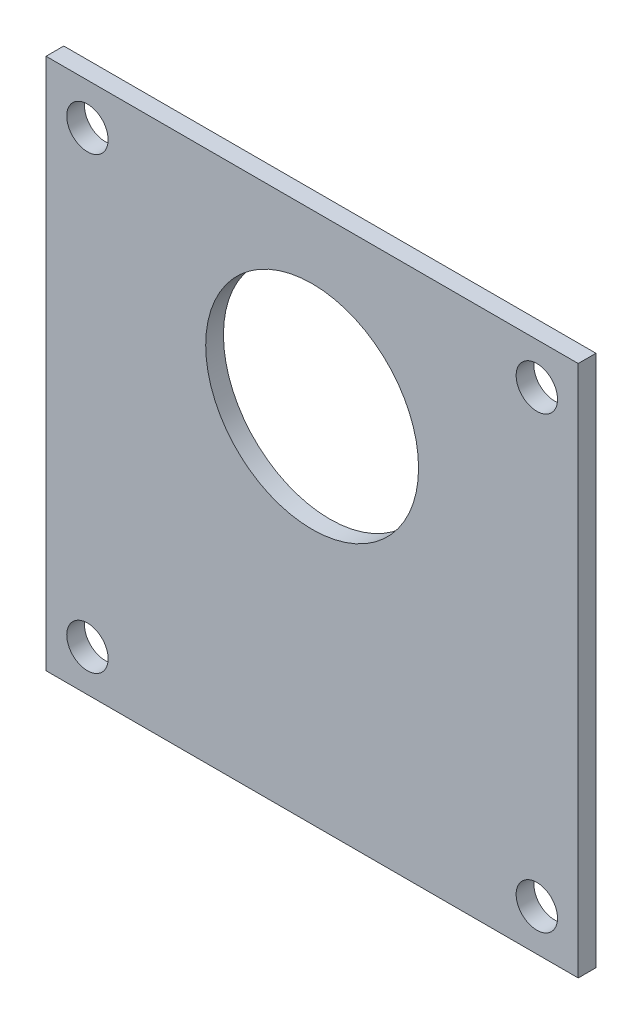
ISO-10303-21;
HEADER;
FILE_DESCRIPTION(('STEP AP214'),'2;1');
FILE_NAME('part.step','',(''),(''),'','','');
FILE_SCHEMA(('AUTOMOTIVE_DESIGN { 1 0 10303 214 1 1 1 1 }'));
ENDSEC;
DATA;
#1=APPLICATION_CONTEXT('core data for automotive mechanical design processes');
#2=APPLICATION_PROTOCOL_DEFINITION('international standard','automotive_design',2000,#1);
#3=PRODUCT_CONTEXT('',#1,'mechanical');
#4=PRODUCT('Part','Part','',(#3));
#5=PRODUCT_RELATED_PRODUCT_CATEGORY('part','',(#4));
#6=PRODUCT_DEFINITION_FORMATION('','',#4);
#7=PRODUCT_DEFINITION_CONTEXT('part definition',#1,'design');
#8=PRODUCT_DEFINITION('design','',#6,#7);
#9=PRODUCT_DEFINITION_SHAPE('','',#8);
#10=(LENGTH_UNIT() NAMED_UNIT(*) SI_UNIT(.MILLI.,.METRE.));
#11=(NAMED_UNIT(*) PLANE_ANGLE_UNIT() SI_UNIT($,.RADIAN.));
#12=(NAMED_UNIT(*) SI_UNIT($,.STERADIAN.) SOLID_ANGLE_UNIT());
#13=UNCERTAINTY_MEASURE_WITH_UNIT(LENGTH_MEASURE(1.E-05),#10,'distance_accuracy_value','');
#14=(GEOMETRIC_REPRESENTATION_CONTEXT(3) GLOBAL_UNCERTAINTY_ASSIGNED_CONTEXT((#13)) GLOBAL_UNIT_ASSIGNED_CONTEXT((#10,
#11,#12)) REPRESENTATION_CONTEXT('',''));
#15=CARTESIAN_POINT('',(0.,0.,0.));
#16=DIRECTION('',(0.,0.,1.));
#17=DIRECTION('',(1.,0.,0.));
#18=AXIS2_PLACEMENT_3D('',#15,#16,#17);
#19=CARTESIAN_POINT('',(22.5,22.5,1.5));
#20=DIRECTION('',(-1.,0.,0.));
#21=DIRECTION('',(0.,-1.,0.));
#22=AXIS2_PLACEMENT_3D('',#19,#20,#21);
#23=PLANE('',#22);
#24=DIRECTION('',(0.,1.,0.));
#25=VECTOR('',#24,1.);
#26=CARTESIAN_POINT('',(22.5,22.5,0.));
#27=LINE('',#26,#25);
#28=CARTESIAN_POINT('',(22.5,-22.5,0.));
#29=VERTEX_POINT('',#28);
#30=CARTESIAN_POINT('',(22.5,22.5,0.));
#31=VERTEX_POINT('',#30);
#32=EDGE_CURVE('E96',#29,#31,#27,.T.);
#33=ORIENTED_EDGE('',*,*,#32,.T.);
#34=DIRECTION('',(0.,0.,-1.));
#35=VECTOR('',#34,1.);
#36=CARTESIAN_POINT('',(22.5,22.5,1.5));
#37=LINE('',#36,#35);
#38=CARTESIAN_POINT('',(22.5,22.5,1.5));
#39=VERTEX_POINT('',#38);
#40=EDGE_CURVE('E11',#39,#31,#37,.T.);
#41=ORIENTED_EDGE('',*,*,#40,.F.);
#42=DIRECTION('',(0.,1.,0.));
#43=VECTOR('',#42,1.);
#44=CARTESIAN_POINT('',(22.5,22.5,1.5));
#45=LINE('',#44,#43);
#46=CARTESIAN_POINT('',(22.5,-22.5,1.5));
#47=VERTEX_POINT('',#46);
#48=EDGE_CURVE('E84',#47,#39,#45,.T.);
#49=ORIENTED_EDGE('',*,*,#48,.F.);
#50=DIRECTION('',(0.,0.,-1.));
#51=VECTOR('',#50,1.);
#52=CARTESIAN_POINT('',(22.5,-22.5,1.5));
#53=LINE('',#52,#51);
#54=EDGE_CURVE('E92',#47,#29,#53,.T.);
#55=ORIENTED_EDGE('',*,*,#54,.T.);
#56=EDGE_LOOP('',(#33,#41,#49,#55));
#57=FACE_BOUND('',#56,.T.);
#58=ADVANCED_FACE('F33',(#57),#23,.F.);
#59=CARTESIAN_POINT('',(-22.5,22.5,1.5));
#60=DIRECTION('',(0.,-1.,0.));
#61=DIRECTION('',(0.,0.,-1.));
#62=AXIS2_PLACEMENT_3D('',#59,#60,#61);
#63=PLANE('',#62);
#64=DIRECTION('',(-1.,0.,0.));
#65=VECTOR('',#64,1.);
#66=CARTESIAN_POINT('',(-22.5,22.5,0.));
#67=LINE('',#66,#65);
#68=CARTESIAN_POINT('',(-22.5,22.5,0.));
#69=VERTEX_POINT('',#68);
#70=EDGE_CURVE('E88',#31,#69,#67,.T.);
#71=ORIENTED_EDGE('',*,*,#70,.T.);
#72=DIRECTION('',(0.,0.,-1.));
#73=VECTOR('',#72,1.);
#74=CARTESIAN_POINT('',(-22.5,22.5,1.5));
#75=LINE('',#74,#73);
#76=CARTESIAN_POINT('',(-22.5,22.5,1.5));
#77=VERTEX_POINT('',#76);
#78=EDGE_CURVE('E41',#77,#69,#75,.T.);
#79=ORIENTED_EDGE('',*,*,#78,.F.);
#80=DIRECTION('',(-1.,0.,0.));
#81=VECTOR('',#80,1.);
#82=CARTESIAN_POINT('',(-22.5,22.5,1.5));
#83=LINE('',#82,#81);
#84=EDGE_CURVE('E79',#39,#77,#83,.T.);
#85=ORIENTED_EDGE('',*,*,#84,.F.);
#86=ORIENTED_EDGE('',*,*,#40,.T.);
#87=EDGE_LOOP('',(#71,#79,#85,#86));
#88=FACE_BOUND('',#87,.T.);
#89=ADVANCED_FACE('F87',(#88),#63,.F.);
#90=CARTESIAN_POINT('',(-22.5,22.5,1.5));
#91=DIRECTION('',(1.,0.,0.));
#92=DIRECTION('',(0.,1.,0.));
#93=AXIS2_PLACEMENT_3D('',#90,#91,#92);
#94=PLANE('',#93);
#95=DIRECTION('',(0.,-1.,0.));
#96=VECTOR('',#95,1.);
#97=CARTESIAN_POINT('',(-22.5,22.5,0.));
#98=LINE('',#97,#96);
#99=CARTESIAN_POINT('',(-22.5,-22.5,0.));
#100=VERTEX_POINT('',#99);
#101=EDGE_CURVE('E66',#69,#100,#98,.T.);
#102=ORIENTED_EDGE('',*,*,#101,.T.);
#103=DIRECTION('',(0.,0.,-1.));
#104=VECTOR('',#103,1.);
#105=CARTESIAN_POINT('',(-22.5,-22.5,1.5));
#106=LINE('',#105,#104);
#107=CARTESIAN_POINT('',(-22.5,-22.5,1.5));
#108=VERTEX_POINT('',#107);
#109=EDGE_CURVE('E89',#108,#100,#106,.T.);
#110=ORIENTED_EDGE('',*,*,#109,.F.);
#111=DIRECTION('',(0.,-1.,0.));
#112=VECTOR('',#111,1.);
#113=CARTESIAN_POINT('',(-22.5,22.5,1.5));
#114=LINE('',#113,#112);
#115=EDGE_CURVE('E82',#77,#108,#114,.T.);
#116=ORIENTED_EDGE('',*,*,#115,.F.);
#117=ORIENTED_EDGE('',*,*,#78,.T.);
#118=EDGE_LOOP('',(#102,#110,#116,#117));
#119=FACE_BOUND('',#118,.T.);
#120=ADVANCED_FACE('F90',(#119),#94,.F.);
#121=CARTESIAN_POINT('',(-22.5,-22.5,1.5));
#122=DIRECTION('',(0.,1.,0.));
#123=DIRECTION('',(0.,0.,1.));
#124=AXIS2_PLACEMENT_3D('',#121,#122,#123);
#125=PLANE('',#124);
#126=DIRECTION('',(1.,0.,0.));
#127=VECTOR('',#126,1.);
#128=CARTESIAN_POINT('',(-22.5,-22.5,0.));
#129=LINE('',#128,#127);
#130=EDGE_CURVE('E72',#100,#29,#129,.T.);
#131=ORIENTED_EDGE('',*,*,#130,.T.);
#132=ORIENTED_EDGE('',*,*,#54,.F.);
#133=DIRECTION('',(1.,0.,0.));
#134=VECTOR('',#133,1.);
#135=CARTESIAN_POINT('',(-22.5,-22.5,1.5));
#136=LINE('',#135,#134);
#137=EDGE_CURVE('E49',#108,#47,#136,.T.);
#138=ORIENTED_EDGE('',*,*,#137,.F.);
#139=ORIENTED_EDGE('',*,*,#109,.T.);
#140=EDGE_LOOP('',(#131,#132,#138,#139));
#141=FACE_BOUND('',#140,.T.);
#142=ADVANCED_FACE('F104',(#141),#125,.F.);
#143=CARTESIAN_POINT('',(0.,0.,1.5));
#144=DIRECTION('',(0.,0.,1.));
#145=DIRECTION('',(1.,0.,0.));
#146=AXIS2_PLACEMENT_3D('',#143,#144,#145);
#147=PLANE('',#146);
#148=CARTESIAN_POINT('',(0.,8.1,1.5));
#149=DIRECTION('',(0.,0.,1.));
#150=DIRECTION('',(1.,0.,0.));
#151=AXIS2_PLACEMENT_3D('',#148,#149,#150);
#152=CIRCLE('',#151,9.);
#153=CARTESIAN_POINT('',(9.,8.1,1.5));
#154=VERTEX_POINT('',#153);
#155=EDGE_CURVE('E134',#154,#154,#152,.T.);
#156=ORIENTED_EDGE('',*,*,#155,.F.);
#157=EDGE_LOOP('',(#156));
#158=FACE_BOUND('',#157,.T.);
#159=CARTESIAN_POINT('',(-19.,-19.,1.5));
#160=DIRECTION('',(0.,0.,1.));
#161=DIRECTION('',(-1.,0.,0.));
#162=AXIS2_PLACEMENT_3D('',#159,#160,#161);
#163=CIRCLE('',#162,1.75);
#164=CARTESIAN_POINT('',(-20.75,-19.,1.5));
#165=VERTEX_POINT('',#164);
#166=EDGE_CURVE('E128',#165,#165,#163,.T.);
#167=ORIENTED_EDGE('',*,*,#166,.F.);
#168=EDGE_LOOP('',(#167));
#169=FACE_BOUND('',#168,.T.);
#170=CARTESIAN_POINT('',(19.,19.,1.5));
#171=DIRECTION('',(0.,0.,1.));
#172=DIRECTION('',(1.,0.,0.));
#173=AXIS2_PLACEMENT_3D('',#170,#171,#172);
#174=CIRCLE('',#173,1.75000000000004);
#175=CARTESIAN_POINT('',(20.75,19.,1.5));
#176=VERTEX_POINT('',#175);
#177=EDGE_CURVE('E122',#176,#176,#174,.T.);
#178=ORIENTED_EDGE('',*,*,#177,.F.);
#179=EDGE_LOOP('',(#178));
#180=FACE_BOUND('',#179,.T.);
#181=CARTESIAN_POINT('',(19.,-19.,1.5));
#182=DIRECTION('',(0.,0.,1.));
#183=DIRECTION('',(-1.,0.,0.));
#184=AXIS2_PLACEMENT_3D('',#181,#182,#183);
#185=CIRCLE('',#184,1.75000000000002);
#186=CARTESIAN_POINT('',(17.25,-19.,1.5));
#187=VERTEX_POINT('',#186);
#188=EDGE_CURVE('E116',#187,#187,#185,.T.);
#189=ORIENTED_EDGE('',*,*,#188,.F.);
#190=EDGE_LOOP('',(#189));
#191=FACE_BOUND('',#190,.T.);
#192=CARTESIAN_POINT('',(-19.,19.,1.5));
#193=DIRECTION('',(0.,0.,1.));
#194=DIRECTION('',(1.,0.,0.));
#195=AXIS2_PLACEMENT_3D('',#192,#193,#194);
#196=CIRCLE('',#195,1.75);
#197=CARTESIAN_POINT('',(-17.25,19.,1.5));
#198=VERTEX_POINT('',#197);
#199=EDGE_CURVE('E110',#198,#198,#196,.T.);
#200=ORIENTED_EDGE('',*,*,#199,.F.);
#201=EDGE_LOOP('',(#200));
#202=FACE_BOUND('',#201,.T.);
#203=ORIENTED_EDGE('',*,*,#48,.T.);
#204=ORIENTED_EDGE('',*,*,#84,.T.);
#205=ORIENTED_EDGE('',*,*,#115,.T.);
#206=ORIENTED_EDGE('',*,*,#137,.T.);
#207=EDGE_LOOP('',(#203,#204,#205,#206));
#208=FACE_BOUND('',#207,.T.);
#209=ADVANCED_FACE('F80',(#158,#169,#180,#191,#202,#208),#147,.T.);
#210=CARTESIAN_POINT('',(0.,0.,0.));
#211=DIRECTION('',(0.,0.,1.));
#212=DIRECTION('',(1.,0.,0.));
#213=AXIS2_PLACEMENT_3D('',#210,#211,#212);
#214=PLANE('',#213);
#215=CARTESIAN_POINT('',(0.,8.1,0.));
#216=DIRECTION('',(0.,0.,1.));
#217=DIRECTION('',(1.,0.,0.));
#218=AXIS2_PLACEMENT_3D('',#215,#216,#217);
#219=CIRCLE('',#218,9.);
#220=CARTESIAN_POINT('',(9.,8.1,0.));
#221=VERTEX_POINT('',#220);
#222=EDGE_CURVE('E131',#221,#221,#219,.T.);
#223=ORIENTED_EDGE('',*,*,#222,.T.);
#224=EDGE_LOOP('',(#223));
#225=FACE_BOUND('',#224,.T.);
#226=CARTESIAN_POINT('',(-19.,-19.,0.));
#227=DIRECTION('',(0.,0.,1.));
#228=DIRECTION('',(-1.,0.,0.));
#229=AXIS2_PLACEMENT_3D('',#226,#227,#228);
#230=CIRCLE('',#229,1.75);
#231=CARTESIAN_POINT('',(-20.75,-19.,0.));
#232=VERTEX_POINT('',#231);
#233=EDGE_CURVE('E125',#232,#232,#230,.T.);
#234=ORIENTED_EDGE('',*,*,#233,.T.);
#235=EDGE_LOOP('',(#234));
#236=FACE_BOUND('',#235,.T.);
#237=CARTESIAN_POINT('',(19.,19.,0.));
#238=DIRECTION('',(0.,0.,1.));
#239=DIRECTION('',(1.,0.,0.));
#240=AXIS2_PLACEMENT_3D('',#237,#238,#239);
#241=CIRCLE('',#240,1.75000000000004);
#242=CARTESIAN_POINT('',(20.75,19.,0.));
#243=VERTEX_POINT('',#242);
#244=EDGE_CURVE('E119',#243,#243,#241,.T.);
#245=ORIENTED_EDGE('',*,*,#244,.T.);
#246=EDGE_LOOP('',(#245));
#247=FACE_BOUND('',#246,.T.);
#248=CARTESIAN_POINT('',(19.,-19.,0.));
#249=DIRECTION('',(0.,0.,1.));
#250=DIRECTION('',(-1.,0.,0.));
#251=AXIS2_PLACEMENT_3D('',#248,#249,#250);
#252=CIRCLE('',#251,1.75000000000002);
#253=CARTESIAN_POINT('',(17.25,-19.,0.));
#254=VERTEX_POINT('',#253);
#255=EDGE_CURVE('E113',#254,#254,#252,.T.);
#256=ORIENTED_EDGE('',*,*,#255,.T.);
#257=EDGE_LOOP('',(#256));
#258=FACE_BOUND('',#257,.T.);
#259=CARTESIAN_POINT('',(-19.,19.,0.));
#260=DIRECTION('',(0.,0.,1.));
#261=DIRECTION('',(1.,0.,0.));
#262=AXIS2_PLACEMENT_3D('',#259,#260,#261);
#263=CIRCLE('',#262,1.75);
#264=CARTESIAN_POINT('',(-17.25,19.,0.));
#265=VERTEX_POINT('',#264);
#266=EDGE_CURVE('E99',#265,#265,#263,.T.);
#267=ORIENTED_EDGE('',*,*,#266,.T.);
#268=EDGE_LOOP('',(#267));
#269=FACE_BOUND('',#268,.T.);
#270=ORIENTED_EDGE('',*,*,#32,.F.);
#271=ORIENTED_EDGE('',*,*,#130,.F.);
#272=ORIENTED_EDGE('',*,*,#101,.F.);
#273=ORIENTED_EDGE('',*,*,#70,.F.);
#274=EDGE_LOOP('',(#270,#271,#272,#273));
#275=FACE_BOUND('',#274,.T.);
#276=ADVANCED_FACE('F107',(#225,#236,#247,#258,#269,#275),#214,.F.);
#277=CARTESIAN_POINT('',(-19.,19.,0.));
#278=DIRECTION('',(0.,0.,1.));
#279=DIRECTION('',(1.,0.,0.));
#280=AXIS2_PLACEMENT_3D('',#277,#278,#279);
#281=CYLINDRICAL_SURFACE('',#280,1.75);
#282=ORIENTED_EDGE('',*,*,#266,.F.);
#283=EDGE_LOOP('',(#282));
#284=FACE_BOUND('',#283,.T.);
#285=ORIENTED_EDGE('',*,*,#199,.T.);
#286=EDGE_LOOP('',(#285));
#287=FACE_BOUND('',#286,.T.);
#288=ADVANCED_FACE('F160',(#284,#287),#281,.F.);
#289=CARTESIAN_POINT('',(19.,-19.,0.));
#290=DIRECTION('',(0.,0.,1.));
#291=DIRECTION('',(1.,0.,0.));
#292=AXIS2_PLACEMENT_3D('',#289,#290,#291);
#293=CYLINDRICAL_SURFACE('',#292,1.75000000000002);
#294=ORIENTED_EDGE('',*,*,#255,.F.);
#295=EDGE_LOOP('',(#294));
#296=FACE_BOUND('',#295,.T.);
#297=ORIENTED_EDGE('',*,*,#188,.T.);
#298=EDGE_LOOP('',(#297));
#299=FACE_BOUND('',#298,.T.);
#300=ADVANCED_FACE('F162',(#296,#299),#293,.F.);
#301=CARTESIAN_POINT('',(19.,19.,0.));
#302=DIRECTION('',(0.,0.,1.));
#303=DIRECTION('',(1.,0.,0.));
#304=AXIS2_PLACEMENT_3D('',#301,#302,#303);
#305=CYLINDRICAL_SURFACE('',#304,1.75000000000004);
#306=ORIENTED_EDGE('',*,*,#244,.F.);
#307=EDGE_LOOP('',(#306));
#308=FACE_BOUND('',#307,.T.);
#309=ORIENTED_EDGE('',*,*,#177,.T.);
#310=EDGE_LOOP('',(#309));
#311=FACE_BOUND('',#310,.T.);
#312=ADVANCED_FACE('F169',(#308,#311),#305,.F.);
#313=CARTESIAN_POINT('',(-19.,-19.,0.));
#314=DIRECTION('',(0.,0.,1.));
#315=DIRECTION('',(1.,0.,0.));
#316=AXIS2_PLACEMENT_3D('',#313,#314,#315);
#317=CYLINDRICAL_SURFACE('',#316,1.75);
#318=ORIENTED_EDGE('',*,*,#233,.F.);
#319=EDGE_LOOP('',(#318));
#320=FACE_BOUND('',#319,.T.);
#321=ORIENTED_EDGE('',*,*,#166,.T.);
#322=EDGE_LOOP('',(#321));
#323=FACE_BOUND('',#322,.T.);
#324=ADVANCED_FACE('F145',(#320,#323),#317,.F.);
#325=CARTESIAN_POINT('',(0.,8.1,0.));
#326=DIRECTION('',(0.,0.,1.));
#327=DIRECTION('',(1.,0.,0.));
#328=AXIS2_PLACEMENT_3D('',#325,#326,#327);
#329=CYLINDRICAL_SURFACE('',#328,9.);
#330=ORIENTED_EDGE('',*,*,#222,.F.);
#331=EDGE_LOOP('',(#330));
#332=FACE_BOUND('',#331,.T.);
#333=ORIENTED_EDGE('',*,*,#155,.T.);
#334=EDGE_LOOP('',(#333));
#335=FACE_BOUND('',#334,.T.);
#336=ADVANCED_FACE('F142',(#332,#335),#329,.F.);
#337=CLOSED_SHELL('',(#58,#89,#120,#142,#209,#276,#288,#300,#312,#324,#336));
#338=MANIFOLD_SOLID_BREP('B2',#337);
#339=ADVANCED_BREP_SHAPE_REPRESENTATION('',(#18,#338),#14);
#340=SHAPE_DEFINITION_REPRESENTATION(#9,#339);
ENDSEC;
END-ISO-10303-21;
